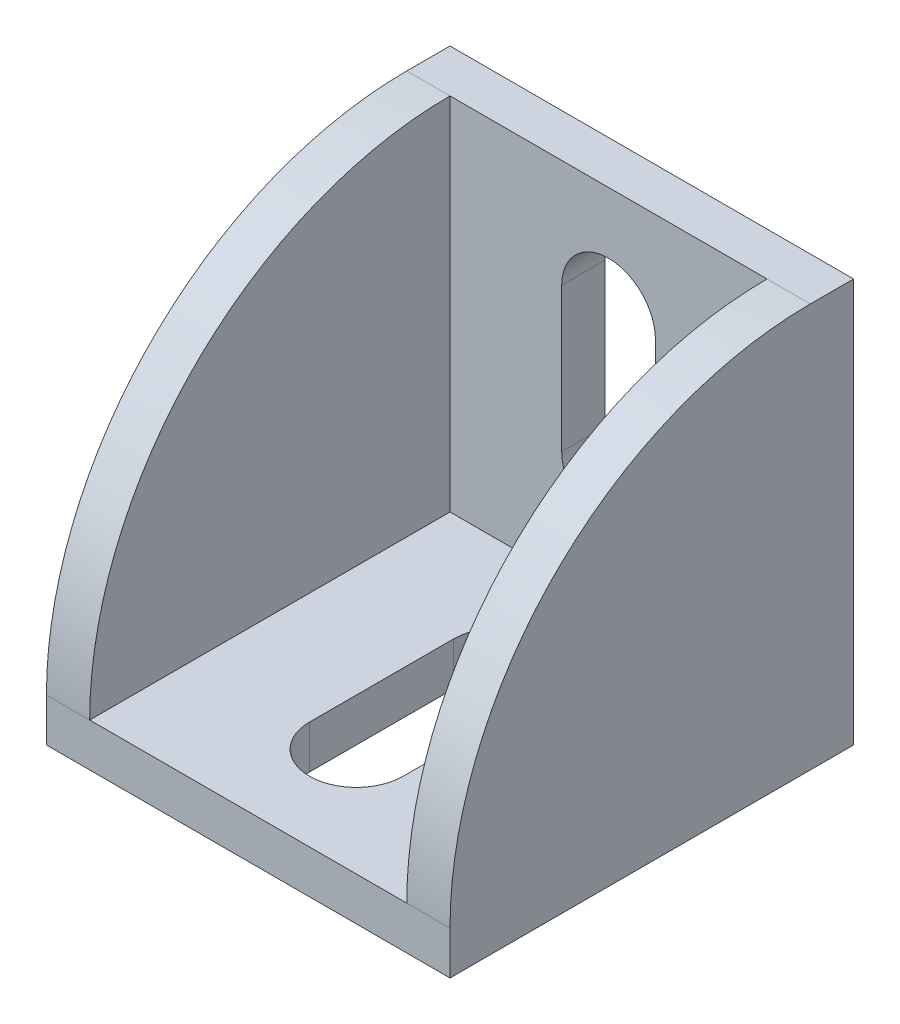
ISO-10303-21;
HEADER;
FILE_DESCRIPTION(('STEP AP214'),'2;1');
FILE_NAME('part.step','',(''),(''),'','','');
FILE_SCHEMA(('AUTOMOTIVE_DESIGN { 1 0 10303 214 1 1 1 1 }'));
ENDSEC;
DATA;
#1=APPLICATION_CONTEXT('core data for automotive mechanical design processes');
#2=APPLICATION_PROTOCOL_DEFINITION('international standard','automotive_design',2000,#1);
#3=PRODUCT_CONTEXT('',#1,'mechanical');
#4=PRODUCT('Part','Part','',(#3));
#5=PRODUCT_RELATED_PRODUCT_CATEGORY('part','',(#4));
#6=PRODUCT_DEFINITION_FORMATION('','',#4);
#7=PRODUCT_DEFINITION_CONTEXT('part definition',#1,'design');
#8=PRODUCT_DEFINITION('design','',#6,#7);
#9=PRODUCT_DEFINITION_SHAPE('','',#8);
#10=(LENGTH_UNIT() NAMED_UNIT(*) SI_UNIT(.MILLI.,.METRE.));
#11=(NAMED_UNIT(*) PLANE_ANGLE_UNIT() SI_UNIT($,.RADIAN.));
#12=(NAMED_UNIT(*) SI_UNIT($,.STERADIAN.) SOLID_ANGLE_UNIT());
#13=UNCERTAINTY_MEASURE_WITH_UNIT(LENGTH_MEASURE(1.E-05),#10,'distance_accuracy_value','');
#14=(GEOMETRIC_REPRESENTATION_CONTEXT(3) GLOBAL_UNCERTAINTY_ASSIGNED_CONTEXT((#13)) GLOBAL_UNIT_ASSIGNED_CONTEXT((#10,
#11,#12)) REPRESENTATION_CONTEXT('',''));
#15=CARTESIAN_POINT('',(0.,0.,0.));
#16=DIRECTION('',(0.,0.,1.));
#17=DIRECTION('',(1.,0.,0.));
#18=AXIS2_PLACEMENT_3D('',#15,#16,#17);
#19=CARTESIAN_POINT('',(0.,3.,0.));
#20=DIRECTION('',(0.,-1.,0.));
#21=DIRECTION('',(0.,0.,-1.));
#22=AXIS2_PLACEMENT_3D('',#19,#20,#21);
#23=PLANE('',#22);
#24=DIRECTION('',(0.,0.,1.));
#25=VECTOR('',#24,1.);
#26=CARTESIAN_POINT('',(10.75,3.,10.5));
#27=LINE('',#26,#25);
#28=CARTESIAN_POINT('',(10.75,3.,10.5));
#29=VERTEX_POINT('',#28);
#30=CARTESIAN_POINT('',(10.75,3.,20.5));
#31=VERTEX_POINT('',#30);
#32=EDGE_CURVE('E176',#29,#31,#27,.T.);
#33=ORIENTED_EDGE('',*,*,#32,.F.);
#34=CARTESIAN_POINT('',(14.,3.,10.5));
#35=DIRECTION('',(0.,1.,0.));
#36=DIRECTION('',(0.,0.,1.));
#37=AXIS2_PLACEMENT_3D('',#34,#35,#36);
#38=CIRCLE('',#37,3.24999999999999);
#39=CARTESIAN_POINT('',(17.25,3.,10.5));
#40=VERTEX_POINT('',#39);
#41=EDGE_CURVE('E51',#40,#29,#38,.T.);
#42=ORIENTED_EDGE('',*,*,#41,.F.);
#43=DIRECTION('',(0.,0.,-1.));
#44=VECTOR('',#43,1.);
#45=CARTESIAN_POINT('',(17.25,3.,10.5));
#46=LINE('',#45,#44);
#47=CARTESIAN_POINT('',(17.25,3.,20.5));
#48=VERTEX_POINT('',#47);
#49=EDGE_CURVE('E167',#48,#40,#46,.T.);
#50=ORIENTED_EDGE('',*,*,#49,.F.);
#51=CARTESIAN_POINT('',(14.,3.,20.5));
#52=DIRECTION('',(0.,1.,0.));
#53=DIRECTION('',(0.,0.,1.));
#54=AXIS2_PLACEMENT_3D('',#51,#52,#53);
#55=CIRCLE('',#54,3.24999999999999);
#56=EDGE_CURVE('E170',#31,#48,#55,.T.);
#57=ORIENTED_EDGE('',*,*,#56,.F.);
#58=EDGE_LOOP('',(#33,#42,#50,#57));
#59=FACE_BOUND('',#58,.T.);
#60=DIRECTION('',(0.,0.,-1.));
#61=VECTOR('',#60,1.);
#62=CARTESIAN_POINT('',(25.,3.,28.));
#63=LINE('',#62,#61);
#64=CARTESIAN_POINT('',(25.,3.,28.));
#65=VERTEX_POINT('',#64);
#66=CARTESIAN_POINT('',(25.,3.,3.));
#67=VERTEX_POINT('',#66);
#68=EDGE_CURVE('E223',#65,#67,#63,.T.);
#69=ORIENTED_EDGE('',*,*,#68,.T.);
#70=DIRECTION('',(-1.,0.,0.));
#71=VECTOR('',#70,1.);
#72=CARTESIAN_POINT('',(0.,3.,3.));
#73=LINE('',#72,#71);
#74=CARTESIAN_POINT('',(3.,3.,3.));
#75=VERTEX_POINT('',#74);
#76=EDGE_CURVE('E38',#67,#75,#73,.T.);
#77=ORIENTED_EDGE('',*,*,#76,.T.);
#78=DIRECTION('',(0.,0.,1.));
#79=VECTOR('',#78,1.);
#80=CARTESIAN_POINT('',(3.,3.,3.));
#81=LINE('',#80,#79);
#82=CARTESIAN_POINT('',(3.,3.,28.));
#83=VERTEX_POINT('',#82);
#84=EDGE_CURVE('E234',#75,#83,#81,.T.);
#85=ORIENTED_EDGE('',*,*,#84,.T.);
#86=DIRECTION('',(1.,0.,0.));
#87=VECTOR('',#86,1.);
#88=CARTESIAN_POINT('',(28.,3.,28.));
#89=LINE('',#88,#87);
#90=EDGE_CURVE('E261',#83,#65,#89,.T.);
#91=ORIENTED_EDGE('',*,*,#90,.T.);
#92=EDGE_LOOP('',(#69,#77,#85,#91));
#93=FACE_BOUND('',#92,.T.);
#94=ADVANCED_FACE('F34',(#59,#93),#23,.F.);
#95=CARTESIAN_POINT('',(0.,0.,3.));
#96=DIRECTION('',(0.,0.,1.));
#97=DIRECTION('',(1.,0.,0.));
#98=AXIS2_PLACEMENT_3D('',#95,#96,#97);
#99=PLANE('',#98);
#100=CARTESIAN_POINT('',(14.,10.5,3.));
#101=DIRECTION('',(0.,0.,1.));
#102=DIRECTION('',(1.,0.,0.));
#103=AXIS2_PLACEMENT_3D('',#100,#101,#102);
#104=CIRCLE('',#103,3.25);
#105=CARTESIAN_POINT('',(10.75,10.5,3.));
#106=VERTEX_POINT('',#105);
#107=CARTESIAN_POINT('',(17.25,10.5,3.));
#108=VERTEX_POINT('',#107);
#109=EDGE_CURVE('E182',#106,#108,#104,.T.);
#110=ORIENTED_EDGE('',*,*,#109,.F.);
#111=DIRECTION('',(0.,-1.,0.));
#112=VECTOR('',#111,1.);
#113=CARTESIAN_POINT('',(10.75,10.5,3.));
#114=LINE('',#113,#112);
#115=CARTESIAN_POINT('',(10.75,20.5,3.));
#116=VERTEX_POINT('',#115);
#117=EDGE_CURVE('E190',#116,#106,#114,.T.);
#118=ORIENTED_EDGE('',*,*,#117,.F.);
#119=CARTESIAN_POINT('',(14.,20.5,3.));
#120=DIRECTION('',(0.,0.,1.));
#121=DIRECTION('',(1.,0.,0.));
#122=AXIS2_PLACEMENT_3D('',#119,#120,#121);
#123=CIRCLE('',#122,3.25);
#124=CARTESIAN_POINT('',(17.25,20.5,3.));
#125=VERTEX_POINT('',#124);
#126=EDGE_CURVE('E204',#125,#116,#123,.T.);
#127=ORIENTED_EDGE('',*,*,#126,.F.);
#128=DIRECTION('',(0.,1.,0.));
#129=VECTOR('',#128,1.);
#130=CARTESIAN_POINT('',(17.25,10.5,3.));
#131=LINE('',#130,#129);
#132=EDGE_CURVE('E201',#108,#125,#131,.T.);
#133=ORIENTED_EDGE('',*,*,#132,.F.);
#134=EDGE_LOOP('',(#110,#118,#127,#133));
#135=FACE_BOUND('',#134,.T.);
#136=ORIENTED_EDGE('',*,*,#76,.F.);
#137=DIRECTION('',(0.,1.,0.));
#138=VECTOR('',#137,1.);
#139=CARTESIAN_POINT('',(25.,3.,3.));
#140=LINE('',#139,#138);
#141=CARTESIAN_POINT('',(25.,28.,3.));
#142=VERTEX_POINT('',#141);
#143=EDGE_CURVE('E218',#67,#142,#140,.T.);
#144=ORIENTED_EDGE('',*,*,#143,.T.);
#145=DIRECTION('',(1.,0.,0.));
#146=VECTOR('',#145,1.);
#147=CARTESIAN_POINT('',(28.,28.,3.));
#148=LINE('',#147,#146);
#149=CARTESIAN_POINT('',(3.,28.,3.));
#150=VERTEX_POINT('',#149);
#151=EDGE_CURVE('E249',#150,#142,#148,.T.);
#152=ORIENTED_EDGE('',*,*,#151,.F.);
#153=DIRECTION('',(0.,-1.,0.));
#154=VECTOR('',#153,1.);
#155=CARTESIAN_POINT('',(3.,28.,3.));
#156=LINE('',#155,#154);
#157=EDGE_CURVE('E239',#150,#75,#156,.T.);
#158=ORIENTED_EDGE('',*,*,#157,.T.);
#159=EDGE_LOOP('',(#136,#144,#152,#158));
#160=FACE_BOUND('',#159,.T.);
#161=ADVANCED_FACE('F304',(#135,#160),#99,.T.);
#162=CARTESIAN_POINT('',(0.,3.,28.));
#163=DIRECTION('',(1.,0.,0.));
#164=DIRECTION('',(0.,0.,-1.));
#165=AXIS2_PLACEMENT_3D('',#162,#163,#164);
#166=PLANE('',#165);
#167=DIRECTION('',(0.,-1.,0.));
#168=VECTOR('',#167,1.);
#169=CARTESIAN_POINT('',(0.,3.,28.));
#170=LINE('',#169,#168);
#171=CARTESIAN_POINT('',(0.,3.,28.));
#172=VERTEX_POINT('',#171);
#173=CARTESIAN_POINT('',(0.,0.,28.));
#174=VERTEX_POINT('',#173);
#175=EDGE_CURVE('E11',#172,#174,#170,.T.);
#176=ORIENTED_EDGE('',*,*,#175,.F.);
#177=CARTESIAN_POINT('',(0.,3.,3.));
#178=DIRECTION('',(-1.,0.,0.));
#179=DIRECTION('',(0.,0.,-1.));
#180=AXIS2_PLACEMENT_3D('',#177,#178,#179);
#181=CIRCLE('',#180,25.);
#182=CARTESIAN_POINT('',(0.,28.,3.));
#183=VERTEX_POINT('',#182);
#184=EDGE_CURVE('E231',#172,#183,#181,.T.);
#185=ORIENTED_EDGE('',*,*,#184,.T.);
#186=DIRECTION('',(0.,0.,-1.));
#187=VECTOR('',#186,1.);
#188=CARTESIAN_POINT('',(0.,28.,3.));
#189=LINE('',#188,#187);
#190=CARTESIAN_POINT('',(0.,28.,0.));
#191=VERTEX_POINT('',#190);
#192=EDGE_CURVE('E248',#183,#191,#189,.T.);
#193=ORIENTED_EDGE('',*,*,#192,.T.);
#194=DIRECTION('',(0.,-1.,0.));
#195=VECTOR('',#194,1.);
#196=CARTESIAN_POINT('',(0.,3.,0.));
#197=LINE('',#196,#195);
#198=CARTESIAN_POINT('',(0.,0.,0.));
#199=VERTEX_POINT('',#198);
#200=EDGE_CURVE('E260',#191,#199,#197,.T.);
#201=ORIENTED_EDGE('',*,*,#200,.T.);
#202=DIRECTION('',(0.,0.,1.));
#203=VECTOR('',#202,1.);
#204=CARTESIAN_POINT('',(0.,0.,28.));
#205=LINE('',#204,#203);
#206=EDGE_CURVE('E255',#199,#174,#205,.T.);
#207=ORIENTED_EDGE('',*,*,#206,.T.);
#208=EDGE_LOOP('',(#176,#185,#193,#201,#207));
#209=FACE_BOUND('',#208,.T.);
#210=ADVANCED_FACE('F36',(#209),#166,.F.);
#211=CARTESIAN_POINT('',(28.,3.,28.));
#212=DIRECTION('',(0.,0.,-1.));
#213=DIRECTION('',(-1.,0.,0.));
#214=AXIS2_PLACEMENT_3D('',#211,#212,#213);
#215=PLANE('',#214);
#216=DIRECTION('',(1.,0.,0.));
#217=VECTOR('',#216,1.);
#218=CARTESIAN_POINT('',(28.,0.,28.));
#219=LINE('',#218,#217);
#220=CARTESIAN_POINT('',(28.,0.,28.));
#221=VERTEX_POINT('',#220);
#222=EDGE_CURVE('E264',#174,#221,#219,.T.);
#223=ORIENTED_EDGE('',*,*,#222,.T.);
#224=DIRECTION('',(0.,-1.,0.));
#225=VECTOR('',#224,1.);
#226=CARTESIAN_POINT('',(28.,3.,28.));
#227=LINE('',#226,#225);
#228=CARTESIAN_POINT('',(28.,3.,28.));
#229=VERTEX_POINT('',#228);
#230=EDGE_CURVE('E44',#229,#221,#227,.T.);
#231=ORIENTED_EDGE('',*,*,#230,.F.);
#232=DIRECTION('',(1.,0.,0.));
#233=VECTOR('',#232,1.);
#234=CARTESIAN_POINT('',(25.,3.,28.));
#235=LINE('',#234,#233);
#236=EDGE_CURVE('E229',#65,#229,#235,.T.);
#237=ORIENTED_EDGE('',*,*,#236,.F.);
#238=ORIENTED_EDGE('',*,*,#90,.F.);
#239=EDGE_CURVE('E258',#172,#83,#89,.T.);
#240=ORIENTED_EDGE('',*,*,#239,.F.);
#241=ORIENTED_EDGE('',*,*,#175,.T.);
#242=EDGE_LOOP('',(#223,#231,#237,#238,#240,#241));
#243=FACE_BOUND('',#242,.T.);
#244=ADVANCED_FACE('F316',(#243),#215,.F.);
#245=CARTESIAN_POINT('',(28.,3.,0.));
#246=DIRECTION('',(-1.,0.,0.));
#247=DIRECTION('',(0.,0.,1.));
#248=AXIS2_PLACEMENT_3D('',#245,#246,#247);
#249=PLANE('',#248);
#250=DIRECTION('',(0.,0.,-1.));
#251=VECTOR('',#250,1.);
#252=CARTESIAN_POINT('',(28.,0.,0.));
#253=LINE('',#252,#251);
#254=CARTESIAN_POINT('',(28.,0.,0.));
#255=VERTEX_POINT('',#254);
#256=EDGE_CURVE('E266',#221,#255,#253,.T.);
#257=ORIENTED_EDGE('',*,*,#256,.T.);
#258=DIRECTION('',(0.,-1.,0.));
#259=VECTOR('',#258,1.);
#260=CARTESIAN_POINT('',(28.,3.,0.));
#261=LINE('',#260,#259);
#262=CARTESIAN_POINT('',(28.,28.,0.));
#263=VERTEX_POINT('',#262);
#264=EDGE_CURVE('E272',#263,#255,#261,.T.);
#265=ORIENTED_EDGE('',*,*,#264,.F.);
#266=DIRECTION('',(0.,0.,-1.));
#267=VECTOR('',#266,1.);
#268=CARTESIAN_POINT('',(28.,28.,3.));
#269=LINE('',#268,#267);
#270=CARTESIAN_POINT('',(28.,28.,3.));
#271=VERTEX_POINT('',#270);
#272=EDGE_CURVE('E252',#271,#263,#269,.T.);
#273=ORIENTED_EDGE('',*,*,#272,.F.);
#274=CARTESIAN_POINT('',(28.,3.,3.));
#275=DIRECTION('',(1.,0.,0.));
#276=DIRECTION('',(0.,0.,-1.));
#277=AXIS2_PLACEMENT_3D('',#274,#275,#276);
#278=CIRCLE('',#277,25.);
#279=EDGE_CURVE('E211',#271,#229,#278,.T.);
#280=ORIENTED_EDGE('',*,*,#279,.T.);
#281=ORIENTED_EDGE('',*,*,#230,.T.);
#282=EDGE_LOOP('',(#257,#265,#273,#280,#281));
#283=FACE_BOUND('',#282,.T.);
#284=ADVANCED_FACE('F279',(#283),#249,.F.);
#285=CARTESIAN_POINT('',(0.,3.,0.));
#286=DIRECTION('',(0.,0.,1.));
#287=DIRECTION('',(1.,0.,0.));
#288=AXIS2_PLACEMENT_3D('',#285,#286,#287);
#289=PLANE('',#288);
#290=DIRECTION('',(0.,-1.,0.));
#291=VECTOR('',#290,1.);
#292=CARTESIAN_POINT('',(10.75,10.5,0.));
#293=LINE('',#292,#291);
#294=CARTESIAN_POINT('',(10.75,20.5,0.));
#295=VERTEX_POINT('',#294);
#296=CARTESIAN_POINT('',(10.75,10.5,0.));
#297=VERTEX_POINT('',#296);
#298=EDGE_CURVE('E196',#295,#297,#293,.T.);
#299=ORIENTED_EDGE('',*,*,#298,.T.);
#300=CARTESIAN_POINT('',(14.,10.5,0.));
#301=DIRECTION('',(0.,0.,1.));
#302=DIRECTION('',(1.,0.,0.));
#303=AXIS2_PLACEMENT_3D('',#300,#301,#302);
#304=CIRCLE('',#303,3.25);
#305=CARTESIAN_POINT('',(17.25,10.5,0.));
#306=VERTEX_POINT('',#305);
#307=EDGE_CURVE('E186',#297,#306,#304,.T.);
#308=ORIENTED_EDGE('',*,*,#307,.T.);
#309=DIRECTION('',(0.,1.,0.));
#310=VECTOR('',#309,1.);
#311=CARTESIAN_POINT('',(17.25,10.5,0.));
#312=LINE('',#311,#310);
#313=CARTESIAN_POINT('',(17.25,20.5,0.));
#314=VERTEX_POINT('',#313);
#315=EDGE_CURVE('E189',#306,#314,#312,.T.);
#316=ORIENTED_EDGE('',*,*,#315,.T.);
#317=CARTESIAN_POINT('',(14.,20.5,0.));
#318=DIRECTION('',(0.,0.,1.));
#319=DIRECTION('',(1.,0.,0.));
#320=AXIS2_PLACEMENT_3D('',#317,#318,#319);
#321=CIRCLE('',#320,3.25);
#322=EDGE_CURVE('E193',#314,#295,#321,.T.);
#323=ORIENTED_EDGE('',*,*,#322,.T.);
#324=EDGE_LOOP('',(#299,#308,#316,#323));
#325=FACE_BOUND('',#324,.T.);
#326=DIRECTION('',(-1.,0.,0.));
#327=VECTOR('',#326,1.);
#328=CARTESIAN_POINT('',(0.,0.,0.));
#329=LINE('',#328,#327);
#330=EDGE_CURVE('E268',#255,#199,#329,.T.);
#331=ORIENTED_EDGE('',*,*,#330,.T.);
#332=ORIENTED_EDGE('',*,*,#200,.F.);
#333=DIRECTION('',(1.,0.,0.));
#334=VECTOR('',#333,1.);
#335=CARTESIAN_POINT('',(28.,28.,0.));
#336=LINE('',#335,#334);
#337=EDGE_CURVE('E242',#191,#263,#336,.T.);
#338=ORIENTED_EDGE('',*,*,#337,.T.);
#339=ORIENTED_EDGE('',*,*,#264,.T.);
#340=EDGE_LOOP('',(#331,#332,#338,#339));
#341=FACE_BOUND('',#340,.T.);
#342=ADVANCED_FACE('F286',(#325,#341),#289,.F.);
#343=CARTESIAN_POINT('',(0.,0.,0.));
#344=DIRECTION('',(0.,-1.,0.));
#345=DIRECTION('',(0.,0.,-1.));
#346=AXIS2_PLACEMENT_3D('',#343,#344,#345);
#347=PLANE('',#346);
#348=CARTESIAN_POINT('',(14.,0.,10.5));
#349=DIRECTION('',(0.,1.,0.));
#350=DIRECTION('',(0.,0.,1.));
#351=AXIS2_PLACEMENT_3D('',#348,#349,#350);
#352=CIRCLE('',#351,3.24999999999999);
#353=CARTESIAN_POINT('',(17.25,0.,10.5));
#354=VERTEX_POINT('',#353);
#355=CARTESIAN_POINT('',(10.75,0.,10.5));
#356=VERTEX_POINT('',#355);
#357=EDGE_CURVE('E151',#354,#356,#352,.T.);
#358=ORIENTED_EDGE('',*,*,#357,.T.);
#359=DIRECTION('',(0.,0.,1.));
#360=VECTOR('',#359,1.);
#361=CARTESIAN_POINT('',(10.75,0.,10.5));
#362=LINE('',#361,#360);
#363=CARTESIAN_POINT('',(10.75,0.,20.5));
#364=VERTEX_POINT('',#363);
#365=EDGE_CURVE('E160',#356,#364,#362,.T.);
#366=ORIENTED_EDGE('',*,*,#365,.T.);
#367=CARTESIAN_POINT('',(14.,0.,20.5));
#368=DIRECTION('',(0.,1.,0.));
#369=DIRECTION('',(0.,0.,1.));
#370=AXIS2_PLACEMENT_3D('',#367,#368,#369);
#371=CIRCLE('',#370,3.24999999999999);
#372=CARTESIAN_POINT('',(17.25,0.,20.5));
#373=VERTEX_POINT('',#372);
#374=EDGE_CURVE('E59',#364,#373,#371,.T.);
#375=ORIENTED_EDGE('',*,*,#374,.T.);
#376=DIRECTION('',(0.,0.,-1.));
#377=VECTOR('',#376,1.);
#378=CARTESIAN_POINT('',(17.25,0.,10.5));
#379=LINE('',#378,#377);
#380=EDGE_CURVE('E157',#373,#354,#379,.T.);
#381=ORIENTED_EDGE('',*,*,#380,.T.);
#382=EDGE_LOOP('',(#358,#366,#375,#381));
#383=FACE_BOUND('',#382,.T.);
#384=ORIENTED_EDGE('',*,*,#206,.F.);
#385=ORIENTED_EDGE('',*,*,#330,.F.);
#386=ORIENTED_EDGE('',*,*,#256,.F.);
#387=ORIENTED_EDGE('',*,*,#222,.F.);
#388=EDGE_LOOP('',(#384,#385,#386,#387));
#389=FACE_BOUND('',#388,.T.);
#390=ADVANCED_FACE('F164',(#383,#389),#347,.T.);
#391=CARTESIAN_POINT('',(28.,28.,3.));
#392=DIRECTION('',(0.,1.,0.));
#393=DIRECTION('',(0.,0.,1.));
#394=AXIS2_PLACEMENT_3D('',#391,#392,#393);
#395=PLANE('',#394);
#396=ORIENTED_EDGE('',*,*,#337,.F.);
#397=ORIENTED_EDGE('',*,*,#192,.F.);
#398=EDGE_CURVE('E245',#183,#150,#148,.T.);
#399=ORIENTED_EDGE('',*,*,#398,.T.);
#400=ORIENTED_EDGE('',*,*,#151,.T.);
#401=DIRECTION('',(1.,0.,0.));
#402=VECTOR('',#401,1.);
#403=CARTESIAN_POINT('',(25.,28.,3.));
#404=LINE('',#403,#402);
#405=EDGE_CURVE('E226',#142,#271,#404,.T.);
#406=ORIENTED_EDGE('',*,*,#405,.T.);
#407=ORIENTED_EDGE('',*,*,#272,.T.);
#408=EDGE_LOOP('',(#396,#397,#399,#400,#406,#407));
#409=FACE_BOUND('',#408,.T.);
#410=ADVANCED_FACE('F293',(#409),#395,.T.);
#411=CARTESIAN_POINT('',(3.,3.,3.));
#412=DIRECTION('',(-1.,0.,0.));
#413=DIRECTION('',(0.,0.,1.));
#414=AXIS2_PLACEMENT_3D('',#411,#412,#413);
#415=CYLINDRICAL_SURFACE('',#414,25.);
#416=ORIENTED_EDGE('',*,*,#184,.F.);
#417=ORIENTED_EDGE('',*,*,#239,.T.);
#418=CARTESIAN_POINT('',(3.,3.,3.));
#419=DIRECTION('',(-1.,0.,0.));
#420=DIRECTION('',(0.,0.,-1.));
#421=AXIS2_PLACEMENT_3D('',#418,#419,#420);
#422=CIRCLE('',#421,25.);
#423=EDGE_CURVE('E237',#83,#150,#422,.T.);
#424=ORIENTED_EDGE('',*,*,#423,.T.);
#425=ORIENTED_EDGE('',*,*,#398,.F.);
#426=EDGE_LOOP('',(#416,#417,#424,#425));
#427=FACE_BOUND('',#426,.T.);
#428=ADVANCED_FACE('F314',(#427),#415,.T.);
#429=CARTESIAN_POINT('',(3.,3.,3.));
#430=DIRECTION('',(1.,0.,0.));
#431=DIRECTION('',(0.,0.,-1.));
#432=AXIS2_PLACEMENT_3D('',#429,#430,#431);
#433=PLANE('',#432);
#434=ORIENTED_EDGE('',*,*,#84,.F.);
#435=ORIENTED_EDGE('',*,*,#157,.F.);
#436=ORIENTED_EDGE('',*,*,#423,.F.);
#437=EDGE_LOOP('',(#434,#435,#436));
#438=FACE_BOUND('',#437,.T.);
#439=ADVANCED_FACE('F312',(#438),#433,.T.);
#440=CARTESIAN_POINT('',(25.,3.,3.));
#441=DIRECTION('',(1.,0.,0.));
#442=DIRECTION('',(0.,0.,-1.));
#443=AXIS2_PLACEMENT_3D('',#440,#441,#442);
#444=CYLINDRICAL_SURFACE('',#443,25.);
#445=ORIENTED_EDGE('',*,*,#279,.F.);
#446=ORIENTED_EDGE('',*,*,#405,.F.);
#447=CARTESIAN_POINT('',(25.,3.,3.));
#448=DIRECTION('',(1.,0.,0.));
#449=DIRECTION('',(0.,0.,-1.));
#450=AXIS2_PLACEMENT_3D('',#447,#448,#449);
#451=CIRCLE('',#450,25.);
#452=EDGE_CURVE('E221',#142,#65,#451,.T.);
#453=ORIENTED_EDGE('',*,*,#452,.T.);
#454=ORIENTED_EDGE('',*,*,#236,.T.);
#455=EDGE_LOOP('',(#445,#446,#453,#454));
#456=FACE_BOUND('',#455,.T.);
#457=ADVANCED_FACE('F298',(#456),#444,.T.);
#458=CARTESIAN_POINT('',(25.,3.,3.));
#459=DIRECTION('',(1.,0.,0.));
#460=DIRECTION('',(0.,0.,-1.));
#461=AXIS2_PLACEMENT_3D('',#458,#459,#460);
#462=PLANE('',#461);
#463=ORIENTED_EDGE('',*,*,#143,.F.);
#464=ORIENTED_EDGE('',*,*,#68,.F.);
#465=ORIENTED_EDGE('',*,*,#452,.F.);
#466=EDGE_LOOP('',(#463,#464,#465));
#467=FACE_BOUND('',#466,.T.);
#468=ADVANCED_FACE('F301',(#467),#462,.F.);
#469=CARTESIAN_POINT('',(14.,10.5,0.));
#470=DIRECTION('',(0.,0.,1.));
#471=DIRECTION('',(1.,0.,0.));
#472=AXIS2_PLACEMENT_3D('',#469,#470,#471);
#473=CYLINDRICAL_SURFACE('',#472,3.25);
#474=ORIENTED_EDGE('',*,*,#109,.T.);
#475=DIRECTION('',(0.,0.,1.));
#476=VECTOR('',#475,1.);
#477=CARTESIAN_POINT('',(17.25,10.5,0.));
#478=LINE('',#477,#476);
#479=EDGE_CURVE('E199',#306,#108,#478,.T.);
#480=ORIENTED_EDGE('',*,*,#479,.F.);
#481=ORIENTED_EDGE('',*,*,#307,.F.);
#482=DIRECTION('',(0.,0.,1.));
#483=VECTOR('',#482,1.);
#484=CARTESIAN_POINT('',(10.75,10.5,0.));
#485=LINE('',#484,#483);
#486=EDGE_CURVE('E209',#297,#106,#485,.T.);
#487=ORIENTED_EDGE('',*,*,#486,.T.);
#488=EDGE_LOOP('',(#474,#480,#481,#487));
#489=FACE_BOUND('',#488,.T.);
#490=ADVANCED_FACE('F346',(#489),#473,.F.);
#491=CARTESIAN_POINT('',(10.75,10.5,0.));
#492=DIRECTION('',(-1.,0.,0.));
#493=DIRECTION('',(0.,-1.,0.));
#494=AXIS2_PLACEMENT_3D('',#491,#492,#493);
#495=PLANE('',#494);
#496=ORIENTED_EDGE('',*,*,#117,.T.);
#497=ORIENTED_EDGE('',*,*,#486,.F.);
#498=ORIENTED_EDGE('',*,*,#298,.F.);
#499=DIRECTION('',(0.,0.,1.));
#500=VECTOR('',#499,1.);
#501=CARTESIAN_POINT('',(10.75,20.5,0.));
#502=LINE('',#501,#500);
#503=EDGE_CURVE('E212',#295,#116,#502,.T.);
#504=ORIENTED_EDGE('',*,*,#503,.T.);
#505=EDGE_LOOP('',(#496,#497,#498,#504));
#506=FACE_BOUND('',#505,.T.);
#507=ADVANCED_FACE('F342',(#506),#495,.F.);
#508=CARTESIAN_POINT('',(14.,20.5,0.));
#509=DIRECTION('',(0.,0.,1.));
#510=DIRECTION('',(1.,0.,0.));
#511=AXIS2_PLACEMENT_3D('',#508,#509,#510);
#512=CYLINDRICAL_SURFACE('',#511,3.25);
#513=ORIENTED_EDGE('',*,*,#126,.T.);
#514=ORIENTED_EDGE('',*,*,#503,.F.);
#515=ORIENTED_EDGE('',*,*,#322,.F.);
#516=DIRECTION('',(0.,0.,1.));
#517=VECTOR('',#516,1.);
#518=CARTESIAN_POINT('',(17.25,20.5,0.));
#519=LINE('',#518,#517);
#520=EDGE_CURVE('E214',#314,#125,#519,.T.);
#521=ORIENTED_EDGE('',*,*,#520,.T.);
#522=EDGE_LOOP('',(#513,#514,#515,#521));
#523=FACE_BOUND('',#522,.T.);
#524=ADVANCED_FACE('F354',(#523),#512,.F.);
#525=CARTESIAN_POINT('',(17.25,10.5,0.));
#526=DIRECTION('',(1.,0.,0.));
#527=DIRECTION('',(0.,1.,0.));
#528=AXIS2_PLACEMENT_3D('',#525,#526,#527);
#529=PLANE('',#528);
#530=ORIENTED_EDGE('',*,*,#132,.T.);
#531=ORIENTED_EDGE('',*,*,#520,.F.);
#532=ORIENTED_EDGE('',*,*,#315,.F.);
#533=ORIENTED_EDGE('',*,*,#479,.T.);
#534=EDGE_LOOP('',(#530,#531,#532,#533));
#535=FACE_BOUND('',#534,.T.);
#536=ADVANCED_FACE('F351',(#535),#529,.F.);
#537=CARTESIAN_POINT('',(14.,0.,10.5));
#538=DIRECTION('',(0.,1.,0.));
#539=DIRECTION('',(0.,0.,1.));
#540=AXIS2_PLACEMENT_3D('',#537,#538,#539);
#541=CYLINDRICAL_SURFACE('',#540,3.24999999999999);
#542=ORIENTED_EDGE('',*,*,#41,.T.);
#543=DIRECTION('',(0.,1.,0.));
#544=VECTOR('',#543,1.);
#545=CARTESIAN_POINT('',(10.75,0.,10.5));
#546=LINE('',#545,#544);
#547=EDGE_CURVE('E147',#356,#29,#546,.T.);
#548=ORIENTED_EDGE('',*,*,#547,.F.);
#549=ORIENTED_EDGE('',*,*,#357,.F.);
#550=DIRECTION('',(0.,1.,0.));
#551=VECTOR('',#550,1.);
#552=CARTESIAN_POINT('',(17.25,0.,10.5));
#553=LINE('',#552,#551);
#554=EDGE_CURVE('E180',#354,#40,#553,.T.);
#555=ORIENTED_EDGE('',*,*,#554,.T.);
#556=EDGE_LOOP('',(#542,#548,#549,#555));
#557=FACE_BOUND('',#556,.T.);
#558=ADVANCED_FACE('F149',(#557),#541,.F.);
#559=CARTESIAN_POINT('',(17.25,0.,10.5));
#560=DIRECTION('',(1.,0.,0.));
#561=DIRECTION('',(0.,0.,-1.));
#562=AXIS2_PLACEMENT_3D('',#559,#560,#561);
#563=PLANE('',#562);
#564=ORIENTED_EDGE('',*,*,#49,.T.);
#565=ORIENTED_EDGE('',*,*,#554,.F.);
#566=ORIENTED_EDGE('',*,*,#380,.F.);
#567=DIRECTION('',(0.,1.,0.));
#568=VECTOR('',#567,1.);
#569=CARTESIAN_POINT('',(17.25,0.,20.5));
#570=LINE('',#569,#568);
#571=EDGE_CURVE('E183',#373,#48,#570,.T.);
#572=ORIENTED_EDGE('',*,*,#571,.T.);
#573=EDGE_LOOP('',(#564,#565,#566,#572));
#574=FACE_BOUND('',#573,.T.);
#575=ADVANCED_FACE('F399',(#574),#563,.F.);
#576=CARTESIAN_POINT('',(14.,0.,20.5));
#577=DIRECTION('',(0.,1.,0.));
#578=DIRECTION('',(0.,0.,1.));
#579=AXIS2_PLACEMENT_3D('',#576,#577,#578);
#580=CYLINDRICAL_SURFACE('',#579,3.24999999999999);
#581=ORIENTED_EDGE('',*,*,#56,.T.);
#582=ORIENTED_EDGE('',*,*,#571,.F.);
#583=ORIENTED_EDGE('',*,*,#374,.F.);
#584=DIRECTION('',(0.,1.,0.));
#585=VECTOR('',#584,1.);
#586=CARTESIAN_POINT('',(10.75,0.,20.5));
#587=LINE('',#586,#585);
#588=EDGE_CURVE('E156',#364,#31,#587,.T.);
#589=ORIENTED_EDGE('',*,*,#588,.T.);
#590=EDGE_LOOP('',(#581,#582,#583,#589));
#591=FACE_BOUND('',#590,.T.);
#592=ADVANCED_FACE('F408',(#591),#580,.F.);
#593=CARTESIAN_POINT('',(10.75,0.,10.5));
#594=DIRECTION('',(-1.,0.,0.));
#595=DIRECTION('',(0.,0.,1.));
#596=AXIS2_PLACEMENT_3D('',#593,#594,#595);
#597=PLANE('',#596);
#598=ORIENTED_EDGE('',*,*,#32,.T.);
#599=ORIENTED_EDGE('',*,*,#588,.F.);
#600=ORIENTED_EDGE('',*,*,#365,.F.);
#601=ORIENTED_EDGE('',*,*,#547,.T.);
#602=EDGE_LOOP('',(#598,#599,#600,#601));
#603=FACE_BOUND('',#602,.T.);
#604=ADVANCED_FACE('F161',(#603),#597,.F.);
#605=CLOSED_SHELL('',(#94,#161,#210,#244,#284,#342,#390,#410,#428,#439,#457,#468,#490,#507,#524,
#536,#558,#575,#592,#604));
#606=MANIFOLD_SOLID_BREP('B2',#605);
#607=ADVANCED_BREP_SHAPE_REPRESENTATION('',(#18,#606),#14);
#608=SHAPE_DEFINITION_REPRESENTATION(#9,#607);
ENDSEC;
END-ISO-10303-21;
